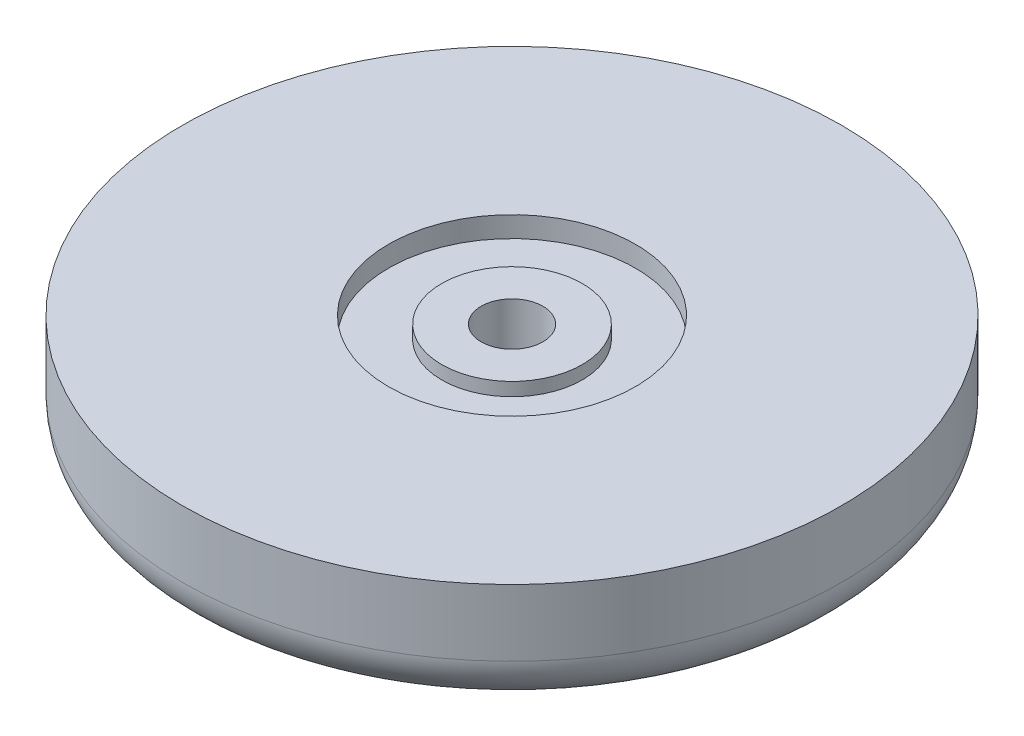
ISO-10303-21;
HEADER;
FILE_DESCRIPTION(('STEP AP214'),'2;1');
FILE_NAME('part.step','',(''),(''),'','','');
FILE_SCHEMA(('AUTOMOTIVE_DESIGN { 1 0 10303 214 1 1 1 1 }'));
ENDSEC;
DATA;
#1=APPLICATION_CONTEXT('core data for automotive mechanical design processes');
#2=APPLICATION_PROTOCOL_DEFINITION('international standard','automotive_design',2000,#1);
#3=PRODUCT_CONTEXT('',#1,'mechanical');
#4=PRODUCT('Part','Part','',(#3));
#5=PRODUCT_RELATED_PRODUCT_CATEGORY('part','',(#4));
#6=PRODUCT_DEFINITION_FORMATION('','',#4);
#7=PRODUCT_DEFINITION_CONTEXT('part definition',#1,'design');
#8=PRODUCT_DEFINITION('design','',#6,#7);
#9=PRODUCT_DEFINITION_SHAPE('','',#8);
#10=(LENGTH_UNIT() NAMED_UNIT(*) SI_UNIT(.MILLI.,.METRE.));
#11=(NAMED_UNIT(*) PLANE_ANGLE_UNIT() SI_UNIT($,.RADIAN.));
#12=(NAMED_UNIT(*) SI_UNIT($,.STERADIAN.) SOLID_ANGLE_UNIT());
#13=UNCERTAINTY_MEASURE_WITH_UNIT(LENGTH_MEASURE(1.E-05),#10,'distance_accuracy_value','');
#14=(GEOMETRIC_REPRESENTATION_CONTEXT(3) GLOBAL_UNCERTAINTY_ASSIGNED_CONTEXT((#13)) GLOBAL_UNIT_ASSIGNED_CONTEXT((#10,
#11,#12)) REPRESENTATION_CONTEXT('',''));
#15=CARTESIAN_POINT('',(0.,0.,0.));
#16=DIRECTION('',(0.,0.,1.));
#17=DIRECTION('',(1.,0.,0.));
#18=AXIS2_PLACEMENT_3D('',#15,#16,#17);
#19=CARTESIAN_POINT('',(0.,0.,0.));
#20=DIRECTION('',(0.,1.,0.));
#21=DIRECTION('',(0.,0.,1.));
#22=AXIS2_PLACEMENT_3D('',#19,#20,#21);
#23=PLANE('',#22);
#24=CARTESIAN_POINT('',(0.,0.,0.));
#25=DIRECTION('',(0.,1.,0.));
#26=DIRECTION('',(0.,0.,1.));
#27=AXIS2_PLACEMENT_3D('',#24,#25,#26);
#28=CIRCLE('',#27,4.1275);
#29=CARTESIAN_POINT('',(0.,0.,4.1275));
#30=VERTEX_POINT('',#29);
#31=EDGE_CURVE('E67',#30,#30,#28,.T.);
#32=ORIENTED_EDGE('',*,*,#31,.T.);
#33=EDGE_LOOP('',(#32));
#34=FACE_BOUND('',#33,.T.);
#35=CARTESIAN_POINT('',(0.,0.,0.));
#36=DIRECTION('',(0.,-1.,0.));
#37=DIRECTION('',(0.,0.,-1.));
#38=AXIS2_PLACEMENT_3D('',#35,#36,#37);
#39=CIRCLE('',#38,24.765);
#40=CARTESIAN_POINT('',(0.,0.,-24.765));
#41=VERTEX_POINT('',#40);
#42=EDGE_CURVE('E95',#41,#41,#39,.T.);
#43=ORIENTED_EDGE('',*,*,#42,.T.);
#44=EDGE_LOOP('',(#43));
#45=FACE_BOUND('',#44,.T.);
#46=ADVANCED_FACE('F42',(#34,#45),#23,.F.);
#47=CARTESIAN_POINT('',(0.,12.468225,0.));
#48=DIRECTION('',(0.,1.,0.));
#49=DIRECTION('',(0.,0.,1.));
#50=AXIS2_PLACEMENT_3D('',#47,#48,#49);
#51=PLANE('',#50);
#52=CARTESIAN_POINT('',(0.,12.468225,0.));
#53=DIRECTION('',(0.,1.,0.));
#54=DIRECTION('',(0.,0.,1.));
#55=AXIS2_PLACEMENT_3D('',#52,#53,#54);
#56=CIRCLE('',#55,16.51);
#57=CARTESIAN_POINT('',(0.,12.468225,16.51));
#58=VERTEX_POINT('',#57);
#59=EDGE_CURVE('E60',#58,#58,#56,.T.);
#60=ORIENTED_EDGE('',*,*,#59,.T.);
#61=EDGE_LOOP('',(#60));
#62=FACE_BOUND('',#61,.T.);
#63=CARTESIAN_POINT('',(0.,12.468225,0.));
#64=DIRECTION('',(0.,1.,0.));
#65=DIRECTION('',(0.,0.,1.));
#66=AXIS2_PLACEMENT_3D('',#63,#64,#65);
#67=CIRCLE('',#66,9.398);
#68=CARTESIAN_POINT('',(0.,12.468225,9.398));
#69=VERTEX_POINT('',#68);
#70=EDGE_CURVE('E75',#69,#69,#67,.T.);
#71=ORIENTED_EDGE('',*,*,#70,.F.);
#72=EDGE_LOOP('',(#71));
#73=FACE_BOUND('',#72,.T.);
#74=ADVANCED_FACE('F134',(#62,#73),#51,.T.);
#75=CARTESIAN_POINT('',(0.,15.24,0.));
#76=DIRECTION('',(0.,-1.,0.));
#77=DIRECTION('',(0.,0.,-1.));
#78=AXIS2_PLACEMENT_3D('',#75,#76,#77);
#79=CYLINDRICAL_SURFACE('',#78,44.069);
#80=CARTESIAN_POINT('',(0.,6.35,0.));
#81=DIRECTION('',(0.,1.,0.));
#82=DIRECTION('',(0.,0.,1.));
#83=AXIS2_PLACEMENT_3D('',#80,#81,#82);
#84=CIRCLE('',#83,44.069);
#85=CARTESIAN_POINT('',(0.,6.35,-44.069));
#86=VERTEX_POINT('',#85);
#87=EDGE_CURVE('E50',#86,#86,#84,.T.);
#88=CARTESIAN_POINT('',(0.,15.24,0.));
#89=DIRECTION('',(0.,1.,0.));
#90=DIRECTION('',(0.,0.,1.));
#91=AXIS2_PLACEMENT_3D('',#88,#89,#90);
#92=CIRCLE('',#91,44.069);
#93=CARTESIAN_POINT('',(0.,15.24,-44.069));
#94=VERTEX_POINT('',#93);
#95=EDGE_CURVE('E55',#94,#94,#92,.T.);
#96=CARTESIAN_POINT('',(0.,6.35,-44.069));
#97=CARTESIAN_POINT('',(0.,6.44260416666666,-44.069));
#98=CARTESIAN_POINT('',(0.,6.53520833333333,-44.069));
#99=CARTESIAN_POINT('',(0.,6.72041666666667,-44.069));
#100=CARTESIAN_POINT('',(0.,6.81302083333333,-44.069));
#101=CARTESIAN_POINT('',(0.,6.99822916666666,-44.069));
#102=CARTESIAN_POINT('',(0.,7.09083333333333,-44.069));
#103=CARTESIAN_POINT('',(0.,7.27604166666666,-44.069));
#104=CARTESIAN_POINT('',(0.,7.36864583333333,-44.069));
#105=CARTESIAN_POINT('',(0.,7.55385416666666,-44.069));
#106=CARTESIAN_POINT('',(0.,7.64645833333333,-44.069));
#107=CARTESIAN_POINT('',(0.,7.83166666666666,-44.069));
#108=CARTESIAN_POINT('',(0.,7.92427083333333,-44.069));
#109=CARTESIAN_POINT('',(0.,8.10947916666666,-44.069));
#110=CARTESIAN_POINT('',(0.,8.20208333333333,-44.069));
#111=CARTESIAN_POINT('',(0.,8.38729166666666,-44.069));
#112=CARTESIAN_POINT('',(0.,8.47989583333333,-44.069));
#113=CARTESIAN_POINT('',(0.,8.66510416666666,-44.069));
#114=CARTESIAN_POINT('',(0.,8.75770833333333,-44.069));
#115=CARTESIAN_POINT('',(0.,8.94291666666666,-44.069));
#116=CARTESIAN_POINT('',(0.,9.03552083333333,-44.069));
#117=CARTESIAN_POINT('',(0.,9.22072916666666,-44.069));
#118=CARTESIAN_POINT('',(0.,9.31333333333333,-44.069));
#119=CARTESIAN_POINT('',(0.,9.49854166666666,-44.069));
#120=CARTESIAN_POINT('',(0.,9.59114583333333,-44.069));
#121=CARTESIAN_POINT('',(0.,9.77635416666666,-44.069));
#122=CARTESIAN_POINT('',(0.,9.86895833333333,-44.069));
#123=CARTESIAN_POINT('',(0.,10.0541666666667,-44.069));
#124=CARTESIAN_POINT('',(0.,10.1467708333333,-44.069));
#125=CARTESIAN_POINT('',(0.,10.3319791666667,-44.069));
#126=CARTESIAN_POINT('',(0.,10.4245833333333,-44.069));
#127=CARTESIAN_POINT('',(0.,10.6097916666667,-44.069));
#128=CARTESIAN_POINT('',(0.,10.7023958333333,-44.069));
#129=CARTESIAN_POINT('',(0.,10.8876041666667,-44.069));
#130=CARTESIAN_POINT('',(0.,10.9802083333333,-44.069));
#131=CARTESIAN_POINT('',(0.,11.1654166666667,-44.069));
#132=CARTESIAN_POINT('',(0.,11.2580208333333,-44.069));
#133=CARTESIAN_POINT('',(0.,11.4432291666667,-44.069));
#134=CARTESIAN_POINT('',(0.,11.5358333333333,-44.069));
#135=CARTESIAN_POINT('',(0.,11.7210416666667,-44.069));
#136=CARTESIAN_POINT('',(0.,11.8136458333333,-44.069));
#137=CARTESIAN_POINT('',(0.,11.9988541666667,-44.069));
#138=CARTESIAN_POINT('',(0.,12.0914583333333,-44.069));
#139=CARTESIAN_POINT('',(0.,12.2766666666667,-44.069));
#140=CARTESIAN_POINT('',(0.,12.3692708333333,-44.069));
#141=CARTESIAN_POINT('',(0.,12.5544791666667,-44.069));
#142=CARTESIAN_POINT('',(0.,12.6470833333333,-44.069));
#143=CARTESIAN_POINT('',(0.,12.8322916666667,-44.069));
#144=CARTESIAN_POINT('',(0.,12.9248958333333,-44.069));
#145=CARTESIAN_POINT('',(0.,13.1101041666667,-44.069));
#146=CARTESIAN_POINT('',(0.,13.2027083333333,-44.069));
#147=CARTESIAN_POINT('',(0.,13.3879166666667,-44.069));
#148=CARTESIAN_POINT('',(0.,13.4805208333333,-44.069));
#149=CARTESIAN_POINT('',(0.,13.6657291666667,-44.069));
#150=CARTESIAN_POINT('',(0.,13.7583333333333,-44.069));
#151=CARTESIAN_POINT('',(0.,13.9435416666667,-44.069));
#152=CARTESIAN_POINT('',(0.,14.0361458333333,-44.069));
#153=CARTESIAN_POINT('',(0.,14.2213541666667,-44.069));
#154=CARTESIAN_POINT('',(0.,14.3139583333333,-44.069));
#155=CARTESIAN_POINT('',(0.,14.4991666666667,-44.069));
#156=CARTESIAN_POINT('',(0.,14.5917708333333,-44.069));
#157=CARTESIAN_POINT('',(0.,14.7769791666667,-44.069));
#158=CARTESIAN_POINT('',(0.,14.8695833333333,-44.069));
#159=CARTESIAN_POINT('',(0.,15.0547916666667,-44.069));
#160=CARTESIAN_POINT('',(0.,15.1473958333333,-44.069));
#161=CARTESIAN_POINT('',(0.,15.24,-44.069));
#162=B_SPLINE_CURVE_WITH_KNOTS('',3,(#96,#97,#98,#99,#100,#101,#102,#103,#104,#105,#106,#107,
#108,#109,#110,#111,#112,#113,#114,#115,#116,#117,#118,#119,#120,#121,#122,#123,#124,#125,#126,
#127,#128,#129,#130,#131,#132,#133,#134,#135,#136,#137,#138,#139,#140,#141,#142,#143,#144,#145,
#146,#147,#148,#149,#150,#151,#152,#153,#154,#155,#156,#157,#158,#159,#160,#161),.UNSPECIFIED.,
.F.,.F.,(4,2,2,2,2,2,2,2,2,2,2,2,2,2,2,2,2,2,2,2,2,2,2,2,2,2,2,2,2,2,2,2,4),(0.,0.2778125,
0.555625000000001,0.833437499999999,1.11125,1.3890625,1.666875,1.9446875,2.2225,2.5003125,
2.778125,3.0559375,3.33375,3.6115625,3.889375,4.1671875,4.445,4.7228125,5.000625,5.2784375,
5.55625,5.8340625,6.111875,6.3896875,6.6675,6.9453125,7.223125,7.5009375,7.77875,8.0565625,
8.334375,8.6121875,8.89),.UNSPECIFIED.);
#163=EDGE_CURVE('BSEAM131',#86,#94,#162,.T.);
#164=ORIENTED_EDGE('',*,*,#87,.T.);
#165=ORIENTED_EDGE('',*,*,#95,.F.);
#166=ORIENTED_EDGE('',*,*,#163,.T.);
#167=ORIENTED_EDGE('',*,*,#163,.F.);
#168=EDGE_LOOP('',(#164,#166,#165,#167));
#169=FACE_BOUND('',#168,.T.);
#170=ADVANCED_FACE('F131',(#169),#79,.T.);
#171=CARTESIAN_POINT('',(0.,15.24,0.));
#172=DIRECTION('',(0.,1.,0.));
#173=DIRECTION('',(0.,0.,1.));
#174=AXIS2_PLACEMENT_3D('',#171,#172,#173);
#175=PLANE('',#174);
#176=CARTESIAN_POINT('',(0.,15.24,0.));
#177=DIRECTION('',(0.,1.,0.));
#178=DIRECTION('',(0.,0.,1.));
#179=AXIS2_PLACEMENT_3D('',#176,#177,#178);
#180=CIRCLE('',#179,16.51);
#181=CARTESIAN_POINT('',(0.,15.24,16.51));
#182=VERTEX_POINT('',#181);
#183=EDGE_CURVE('E63',#182,#182,#180,.T.);
#184=ORIENTED_EDGE('',*,*,#183,.F.);
#185=EDGE_LOOP('',(#184));
#186=FACE_BOUND('',#185,.T.);
#187=ORIENTED_EDGE('',*,*,#95,.T.);
#188=EDGE_LOOP('',(#187));
#189=FACE_BOUND('',#188,.T.);
#190=ADVANCED_FACE('F121',(#186,#189),#175,.T.);
#191=CARTESIAN_POINT('',(0.,0.,0.));
#192=DIRECTION('',(0.,-1.,0.));
#193=DIRECTION('',(0.,0.,-1.));
#194=AXIS2_PLACEMENT_3D('',#191,#192,#193);
#195=CIRCLE('',#194,31.75);
#196=CARTESIAN_POINT('',(0.,0.,-31.75));
#197=VERTEX_POINT('',#196);
#198=EDGE_CURVE('E87',#197,#197,#195,.T.);
#199=ORIENTED_EDGE('',*,*,#198,.F.);
#200=EDGE_LOOP('',(#199));
#201=FACE_BOUND('',#200,.T.);
#202=CARTESIAN_POINT('',(0.,0.,0.));
#203=DIRECTION('',(0.,1.,0.));
#204=DIRECTION('',(0.,0.,1.));
#205=AXIS2_PLACEMENT_3D('',#202,#203,#204);
#206=CIRCLE('',#205,37.719);
#207=CARTESIAN_POINT('',(0.,0.,37.719));
#208=VERTEX_POINT('',#207);
#209=EDGE_CURVE('E10',#208,#208,#206,.F.);
#210=ORIENTED_EDGE('',*,*,#209,.T.);
#211=EDGE_LOOP('',(#210));
#212=FACE_BOUND('',#211,.T.);
#213=ADVANCED_FACE('F118',(#201,#212),#23,.F.);
#214=CARTESIAN_POINT('',(0.,12.468225,0.));
#215=DIRECTION('',(0.,1.,0.));
#216=DIRECTION('',(0.,0.,1.));
#217=AXIS2_PLACEMENT_3D('',#214,#215,#216);
#218=CYLINDRICAL_SURFACE('',#217,16.51);
#219=ORIENTED_EDGE('',*,*,#59,.F.);
#220=EDGE_LOOP('',(#219));
#221=FACE_BOUND('',#220,.T.);
#222=ORIENTED_EDGE('',*,*,#183,.T.);
#223=EDGE_LOOP('',(#222));
#224=FACE_BOUND('',#223,.T.);
#225=ADVANCED_FACE('F120',(#221,#224),#218,.F.);
#226=CARTESIAN_POINT('',(0.,0.,0.));
#227=DIRECTION('',(0.,1.,0.));
#228=DIRECTION('',(0.,0.,1.));
#229=AXIS2_PLACEMENT_3D('',#226,#227,#228);
#230=CYLINDRICAL_SURFACE('',#229,4.1275);
#231=ORIENTED_EDGE('',*,*,#31,.F.);
#232=EDGE_LOOP('',(#231));
#233=FACE_BOUND('',#232,.T.);
#234=CARTESIAN_POINT('',(0.,14.246225,0.));
#235=DIRECTION('',(0.,1.,0.));
#236=DIRECTION('',(0.,0.,1.));
#237=AXIS2_PLACEMENT_3D('',#234,#235,#236);
#238=CIRCLE('',#237,4.1275);
#239=CARTESIAN_POINT('',(0.,14.246225,4.1275));
#240=VERTEX_POINT('',#239);
#241=EDGE_CURVE('E79',#240,#240,#238,.T.);
#242=ORIENTED_EDGE('',*,*,#241,.T.);
#243=EDGE_LOOP('',(#242));
#244=FACE_BOUND('',#243,.T.);
#245=ADVANCED_FACE('F127',(#233,#244),#230,.F.);
#246=CARTESIAN_POINT('',(0.,14.246225,0.));
#247=DIRECTION('',(0.,1.,0.));
#248=DIRECTION('',(0.,0.,1.));
#249=AXIS2_PLACEMENT_3D('',#246,#247,#248);
#250=PLANE('',#249);
#251=CARTESIAN_POINT('',(0.,14.246225,0.));
#252=DIRECTION('',(0.,1.,0.));
#253=DIRECTION('',(0.,0.,1.));
#254=AXIS2_PLACEMENT_3D('',#251,#252,#253);
#255=CIRCLE('',#254,9.398);
#256=CARTESIAN_POINT('',(0.,14.246225,9.398));
#257=VERTEX_POINT('',#256);
#258=EDGE_CURVE('E74',#257,#257,#255,.T.);
#259=ORIENTED_EDGE('',*,*,#258,.T.);
#260=EDGE_LOOP('',(#259));
#261=FACE_BOUND('',#260,.T.);
#262=ORIENTED_EDGE('',*,*,#241,.F.);
#263=EDGE_LOOP('',(#262));
#264=FACE_BOUND('',#263,.T.);
#265=ADVANCED_FACE('F150',(#261,#264),#250,.T.);
#266=CARTESIAN_POINT('',(0.,14.246225,0.));
#267=DIRECTION('',(0.,-1.,0.));
#268=DIRECTION('',(0.,0.,-1.));
#269=AXIS2_PLACEMENT_3D('',#266,#267,#268);
#270=CYLINDRICAL_SURFACE('',#269,9.398);
#271=ORIENTED_EDGE('',*,*,#258,.F.);
#272=EDGE_LOOP('',(#271));
#273=FACE_BOUND('',#272,.T.);
#274=ORIENTED_EDGE('',*,*,#70,.T.);
#275=EDGE_LOOP('',(#274));
#276=FACE_BOUND('',#275,.T.);
#277=ADVANCED_FACE('F153',(#273,#276),#270,.T.);
#278=CARTESIAN_POINT('',(0.,6.35,0.));
#279=DIRECTION('',(0.,1.,0.));
#280=DIRECTION('',(0.,0.,1.));
#281=AXIS2_PLACEMENT_3D('',#278,#279,#280);
#282=TOROIDAL_SURFACE('',#281,37.719,6.35);
#283=ORIENTED_EDGE('',*,*,#209,.F.);
#284=EDGE_LOOP('',(#283));
#285=FACE_BOUND('',#284,.T.);
#286=ORIENTED_EDGE('',*,*,#87,.F.);
#287=EDGE_LOOP('',(#286));
#288=FACE_BOUND('',#287,.T.);
#289=ADVANCED_FACE('F44',(#285,#288),#282,.T.);
#290=CARTESIAN_POINT('',(0.,1.27,0.));
#291=DIRECTION('',(0.,-1.,0.));
#292=DIRECTION('',(0.,0.,-1.));
#293=AXIS2_PLACEMENT_3D('',#290,#291,#292);
#294=CYLINDRICAL_SURFACE('',#293,31.75);
#295=CARTESIAN_POINT('',(0.,1.27,0.));
#296=DIRECTION('',(0.,-1.,0.));
#297=DIRECTION('',(0.,0.,-1.));
#298=AXIS2_PLACEMENT_3D('',#295,#296,#297);
#299=CIRCLE('',#298,31.75);
#300=CARTESIAN_POINT('',(0.,1.27,-31.75));
#301=VERTEX_POINT('',#300);
#302=EDGE_CURVE('E86',#301,#301,#299,.T.);
#303=ORIENTED_EDGE('',*,*,#302,.F.);
#304=EDGE_LOOP('',(#303));
#305=FACE_BOUND('',#304,.T.);
#306=ORIENTED_EDGE('',*,*,#198,.T.);
#307=EDGE_LOOP('',(#306));
#308=FACE_BOUND('',#307,.T.);
#309=ADVANCED_FACE('F109',(#305,#308),#294,.F.);
#310=CARTESIAN_POINT('',(0.,1.27,0.));
#311=DIRECTION('',(0.,-1.,0.));
#312=DIRECTION('',(0.,0.,-1.));
#313=AXIS2_PLACEMENT_3D('',#310,#311,#312);
#314=PLANE('',#313);
#315=CARTESIAN_POINT('',(0.,1.27,0.));
#316=DIRECTION('',(0.,-1.,0.));
#317=DIRECTION('',(0.,0.,-1.));
#318=AXIS2_PLACEMENT_3D('',#315,#316,#317);
#319=CIRCLE('',#318,24.765);
#320=CARTESIAN_POINT('',(0.,1.27,-24.765));
#321=VERTEX_POINT('',#320);
#322=EDGE_CURVE('E91',#321,#321,#319,.T.);
#323=ORIENTED_EDGE('',*,*,#322,.F.);
#324=EDGE_LOOP('',(#323));
#325=FACE_BOUND('',#324,.T.);
#326=ORIENTED_EDGE('',*,*,#302,.T.);
#327=EDGE_LOOP('',(#326));
#328=FACE_BOUND('',#327,.T.);
#329=ADVANCED_FACE('F106',(#325,#328),#314,.T.);
#330=CARTESIAN_POINT('',(0.,1.27,0.));
#331=DIRECTION('',(0.,-1.,0.));
#332=DIRECTION('',(0.,0.,-1.));
#333=AXIS2_PLACEMENT_3D('',#330,#331,#332);
#334=CYLINDRICAL_SURFACE('',#333,24.765);
#335=ORIENTED_EDGE('',*,*,#322,.T.);
#336=EDGE_LOOP('',(#335));
#337=FACE_BOUND('',#336,.T.);
#338=ORIENTED_EDGE('',*,*,#42,.F.);
#339=EDGE_LOOP('',(#338));
#340=FACE_BOUND('',#339,.T.);
#341=ADVANCED_FACE('F103',(#337,#340),#334,.T.);
#342=CLOSED_SHELL('',(#46,#74,#170,#190,#213,#225,#245,#265,#277,#289,#309,#329,#341));
#343=MANIFOLD_SOLID_BREP('B2',#342);
#344=ADVANCED_BREP_SHAPE_REPRESENTATION('',(#18,#343),#14);
#345=SHAPE_DEFINITION_REPRESENTATION(#9,#344);
ENDSEC;
END-ISO-10303-21;
